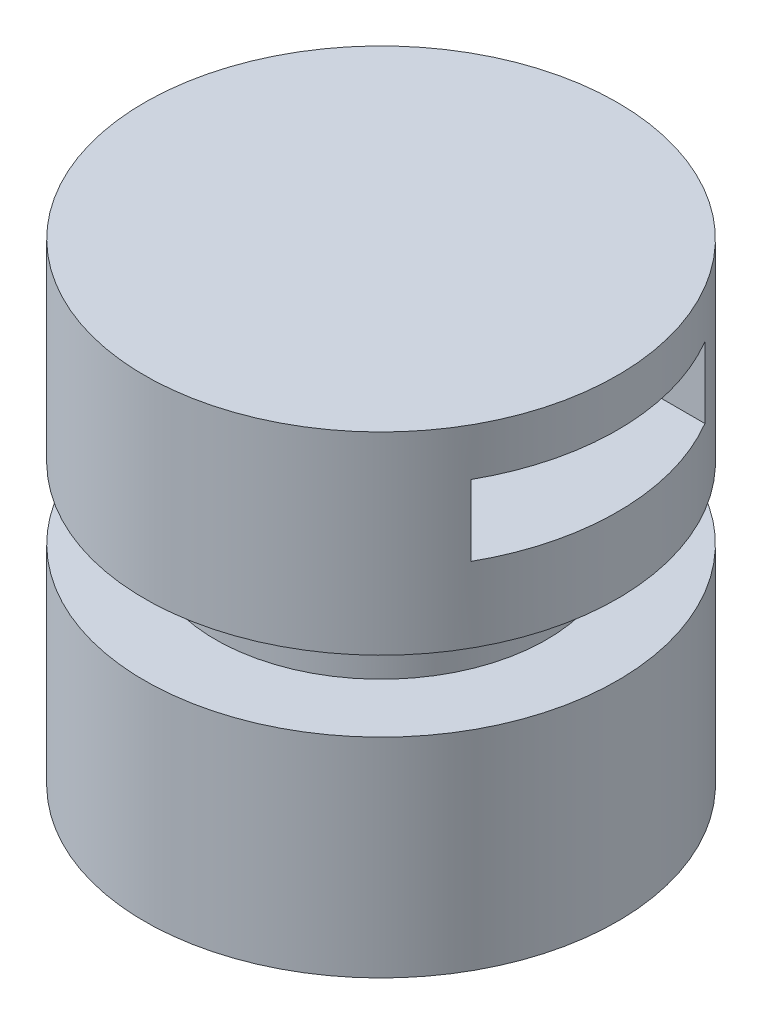
ISO-10303-21;
HEADER;
FILE_DESCRIPTION(('STEP AP214'),'2;1');
FILE_NAME('part.step','',(''),(''),'','','');
FILE_SCHEMA(('AUTOMOTIVE_DESIGN { 1 0 10303 214 1 1 1 1 }'));
ENDSEC;
DATA;
#1=APPLICATION_CONTEXT('core data for automotive mechanical design processes');
#2=APPLICATION_PROTOCOL_DEFINITION('international standard','automotive_design',2000,#1);
#3=PRODUCT_CONTEXT('',#1,'mechanical');
#4=PRODUCT('Part','Part','',(#3));
#5=PRODUCT_RELATED_PRODUCT_CATEGORY('part','',(#4));
#6=PRODUCT_DEFINITION_FORMATION('','',#4);
#7=PRODUCT_DEFINITION_CONTEXT('part definition',#1,'design');
#8=PRODUCT_DEFINITION('design','',#6,#7);
#9=PRODUCT_DEFINITION_SHAPE('','',#8);
#10=(LENGTH_UNIT() NAMED_UNIT(*) SI_UNIT(.MILLI.,.METRE.));
#11=(NAMED_UNIT(*) PLANE_ANGLE_UNIT() SI_UNIT($,.RADIAN.));
#12=(NAMED_UNIT(*) SI_UNIT($,.STERADIAN.) SOLID_ANGLE_UNIT());
#13=UNCERTAINTY_MEASURE_WITH_UNIT(LENGTH_MEASURE(1.E-05),#10,'distance_accuracy_value','');
#14=(GEOMETRIC_REPRESENTATION_CONTEXT(3) GLOBAL_UNCERTAINTY_ASSIGNED_CONTEXT((#13)) GLOBAL_UNIT_ASSIGNED_CONTEXT((#10,
#11,#12)) REPRESENTATION_CONTEXT('',''));
#15=CARTESIAN_POINT('',(0.,0.,0.));
#16=DIRECTION('',(0.,0.,1.));
#17=DIRECTION('',(1.,0.,0.));
#18=AXIS2_PLACEMENT_3D('',#15,#16,#17);
#19=CARTESIAN_POINT('',(0.,0.,0.));
#20=DIRECTION('',(0.,-1.,0.));
#21=DIRECTION('',(0.,0.,-1.));
#22=AXIS2_PLACEMENT_3D('',#19,#20,#21);
#23=CYLINDRICAL_SURFACE('',#22,100.);
#24=CARTESIAN_POINT('',(0.,150.,0.));
#25=DIRECTION('',(0.,1.,0.));
#26=DIRECTION('',(0.,0.,1.));
#27=AXIS2_PLACEMENT_3D('',#24,#25,#26);
#28=CIRCLE('',#27,100.);
#29=CARTESIAN_POINT('',(87.1076393875428,150.,49.1147550164897));
#30=VERTEX_POINT('',#29);
#31=CARTESIAN_POINT('',(86.0853753140923,150.,-50.8852449835104));
#32=VERTEX_POINT('',#31);
#33=EDGE_CURVE('E77',#30,#32,#28,.T.);
#34=ORIENTED_EDGE('',*,*,#33,.F.);
#35=DIRECTION('',(0.,-1.,0.));
#36=VECTOR('',#35,1.);
#37=CARTESIAN_POINT('',(87.1076393875428,0.,49.1147550164897));
#38=LINE('',#37,#36);
#39=CARTESIAN_POINT('',(87.1076393875428,180.,49.1147550164897));
#40=VERTEX_POINT('',#39);
#41=EDGE_CURVE('E79',#40,#30,#38,.T.);
#42=ORIENTED_EDGE('',*,*,#41,.F.);
#43=CARTESIAN_POINT('',(0.,180.,0.));
#44=DIRECTION('',(0.,1.,0.));
#45=DIRECTION('',(0.,0.,1.));
#46=AXIS2_PLACEMENT_3D('',#43,#44,#45);
#47=CIRCLE('',#46,100.);
#48=CARTESIAN_POINT('',(86.0853753140923,180.,-50.8852449835104));
#49=VERTEX_POINT('',#48);
#50=EDGE_CURVE('E56',#40,#49,#47,.T.);
#51=ORIENTED_EDGE('',*,*,#50,.T.);
#52=DIRECTION('',(0.,-1.,0.));
#53=VECTOR('',#52,1.);
#54=CARTESIAN_POINT('',(86.0853753140923,0.,-50.8852449835104));
#55=LINE('',#54,#53);
#56=EDGE_CURVE('E80',#49,#32,#55,.T.);
#57=ORIENTED_EDGE('',*,*,#56,.T.);
#58=EDGE_LOOP('',(#34,#42,#51,#57));
#59=FACE_BOUND('',#58,.T.);
#60=CARTESIAN_POINT('',(0.,200.,0.));
#61=DIRECTION('',(0.,-1.,0.));
#62=DIRECTION('',(0.,0.,-1.));
#63=AXIS2_PLACEMENT_3D('',#60,#61,#62);
#64=CIRCLE('',#63,100.);
#65=CARTESIAN_POINT('',(0.,200.,-100.));
#66=VERTEX_POINT('',#65);
#67=EDGE_CURVE('E84',#66,#66,#64,.T.);
#68=ORIENTED_EDGE('',*,*,#67,.T.);
#69=EDGE_LOOP('',(#68));
#70=FACE_BOUND('',#69,.T.);
#71=CARTESIAN_POINT('',(0.,118.22070212667,0.));
#72=DIRECTION('',(0.,-1.,0.));
#73=DIRECTION('',(0.,0.,-1.));
#74=AXIS2_PLACEMENT_3D('',#71,#72,#73);
#75=CIRCLE('',#74,100.);
#76=CARTESIAN_POINT('',(0.,118.22070212667,-100.));
#77=VERTEX_POINT('',#76);
#78=EDGE_CURVE('E102',#77,#77,#75,.T.);
#79=ORIENTED_EDGE('',*,*,#78,.F.);
#80=EDGE_LOOP('',(#79));
#81=FACE_BOUND('',#80,.T.);
#82=DIRECTION('',(0.,-1.,0.));
#83=VECTOR('',#82,1.);
#84=CARTESIAN_POINT('',(-86.0853753140923,0.,-50.8852449835104));
#85=LINE('',#84,#83);
#86=CARTESIAN_POINT('',(-86.0853753140923,150.,-50.8852449835104));
#87=VERTEX_POINT('',#86);
#88=CARTESIAN_POINT('',(-86.0853753140923,180.,-50.8852449835104));
#89=VERTEX_POINT('',#88);
#90=EDGE_CURVE('E11',#87,#89,#85,.F.);
#91=ORIENTED_EDGE('',*,*,#90,.T.);
#92=CARTESIAN_POINT('',(-87.1076393875428,180.,49.1147550164897));
#93=VERTEX_POINT('',#92);
#94=EDGE_CURVE('E117',#89,#93,#47,.T.);
#95=ORIENTED_EDGE('',*,*,#94,.T.);
#96=DIRECTION('',(0.,-1.,0.));
#97=VECTOR('',#96,1.);
#98=CARTESIAN_POINT('',(-87.1076393875428,0.,49.1147550164897));
#99=LINE('',#98,#97);
#100=CARTESIAN_POINT('',(-87.1076393875428,150.,49.1147550164897));
#101=VERTEX_POINT('',#100);
#102=EDGE_CURVE('E41',#101,#93,#99,.F.);
#103=ORIENTED_EDGE('',*,*,#102,.F.);
#104=EDGE_CURVE('E86',#87,#101,#28,.T.);
#105=ORIENTED_EDGE('',*,*,#104,.F.);
#106=EDGE_LOOP('',(#91,#95,#103,#105));
#107=FACE_BOUND('',#106,.T.);
#108=ADVANCED_FACE('F33',(#59,#70,#81,#107),#23,.T.);
#109=CARTESIAN_POINT('',(0.,0.,0.));
#110=DIRECTION('',(0.,-1.,0.));
#111=DIRECTION('',(0.,0.,-1.));
#112=AXIS2_PLACEMENT_3D('',#109,#110,#111);
#113=CIRCLE('',#112,100.);
#114=CARTESIAN_POINT('',(0.,0.,-100.));
#115=VERTEX_POINT('',#114);
#116=EDGE_CURVE('E111',#115,#115,#113,.T.);
#117=ORIENTED_EDGE('',*,*,#116,.F.);
#118=EDGE_LOOP('',(#117));
#119=FACE_BOUND('',#118,.T.);
#120=CARTESIAN_POINT('',(0.,88.2207021266703,0.));
#121=DIRECTION('',(0.,-1.,0.));
#122=DIRECTION('',(0.,0.,-1.));
#123=AXIS2_PLACEMENT_3D('',#120,#121,#122);
#124=CIRCLE('',#123,100.);
#125=CARTESIAN_POINT('',(0.,88.2207021266703,-100.));
#126=VERTEX_POINT('',#125);
#127=EDGE_CURVE('E105',#126,#126,#124,.T.);
#128=ORIENTED_EDGE('',*,*,#127,.T.);
#129=EDGE_LOOP('',(#128));
#130=FACE_BOUND('',#129,.T.);
#131=ADVANCED_FACE('F134',(#119,#130),#23,.T.);
#132=CARTESIAN_POINT('',(0.,0.,0.));
#133=DIRECTION('',(0.,1.,0.));
#134=DIRECTION('',(0.,0.,1.));
#135=AXIS2_PLACEMENT_3D('',#132,#133,#134);
#136=PLANE('',#135);
#137=ORIENTED_EDGE('',*,*,#116,.T.);
#138=EDGE_LOOP('',(#137));
#139=FACE_BOUND('',#138,.T.);
#140=ADVANCED_FACE('F138',(#139),#136,.F.);
#141=CARTESIAN_POINT('',(0.,0.,0.));
#142=DIRECTION('',(0.,-1.,0.));
#143=DIRECTION('',(0.,0.,-1.));
#144=AXIS2_PLACEMENT_3D('',#141,#142,#143);
#145=CYLINDRICAL_SURFACE('',#144,70.);
#146=CARTESIAN_POINT('',(0.,118.22070212667,0.));
#147=DIRECTION('',(0.,-1.,0.));
#148=DIRECTION('',(0.,0.,-1.));
#149=AXIS2_PLACEMENT_3D('',#146,#147,#148);
#150=CIRCLE('',#149,70.);
#151=CARTESIAN_POINT('',(0.,118.22070212667,-70.));
#152=VERTEX_POINT('',#151);
#153=EDGE_CURVE('E99',#152,#152,#150,.T.);
#154=ORIENTED_EDGE('',*,*,#153,.T.);
#155=EDGE_LOOP('',(#154));
#156=FACE_BOUND('',#155,.T.);
#157=CARTESIAN_POINT('',(0.,88.2207021266703,0.));
#158=DIRECTION('',(0.,-1.,0.));
#159=DIRECTION('',(0.,0.,-1.));
#160=AXIS2_PLACEMENT_3D('',#157,#158,#159);
#161=CIRCLE('',#160,70.);
#162=CARTESIAN_POINT('',(0.,88.2207021266703,-70.));
#163=VERTEX_POINT('',#162);
#164=EDGE_CURVE('E108',#163,#163,#161,.T.);
#165=ORIENTED_EDGE('',*,*,#164,.F.);
#166=EDGE_LOOP('',(#165));
#167=FACE_BOUND('',#166,.T.);
#168=ADVANCED_FACE('F143',(#156,#167),#145,.T.);
#169=CARTESIAN_POINT('',(0.,88.2207021266703,70.));
#170=DIRECTION('',(0.,1.,0.));
#171=DIRECTION('',(0.,0.,1.));
#172=AXIS2_PLACEMENT_3D('',#169,#170,#171);
#173=PLANE('',#172);
#174=ORIENTED_EDGE('',*,*,#164,.T.);
#175=EDGE_LOOP('',(#174));
#176=FACE_BOUND('',#175,.T.);
#177=ORIENTED_EDGE('',*,*,#127,.F.);
#178=EDGE_LOOP('',(#177));
#179=FACE_BOUND('',#178,.T.);
#180=ADVANCED_FACE('F147',(#176,#179),#173,.T.);
#181=CARTESIAN_POINT('',(0.,118.22070212667,70.));
#182=DIRECTION('',(0.,-1.,0.));
#183=DIRECTION('',(0.,0.,-1.));
#184=AXIS2_PLACEMENT_3D('',#181,#182,#183);
#185=PLANE('',#184);
#186=ORIENTED_EDGE('',*,*,#78,.T.);
#187=EDGE_LOOP('',(#186));
#188=FACE_BOUND('',#187,.T.);
#189=ORIENTED_EDGE('',*,*,#153,.F.);
#190=EDGE_LOOP('',(#189));
#191=FACE_BOUND('',#190,.T.);
#192=ADVANCED_FACE('F151',(#188,#191),#185,.T.);
#193=CARTESIAN_POINT('',(0.,200.,0.));
#194=DIRECTION('',(0.,-1.,0.));
#195=DIRECTION('',(0.,0.,-1.));
#196=AXIS2_PLACEMENT_3D('',#193,#194,#195);
#197=PLANE('',#196);
#198=ORIENTED_EDGE('',*,*,#67,.F.);
#199=EDGE_LOOP('',(#198));
#200=FACE_BOUND('',#199,.T.);
#201=ADVANCED_FACE('F35',(#200),#197,.F.);
#202=CARTESIAN_POINT('',(-100.,180.,-50.8852449835104));
#203=DIRECTION('',(0.,1.,0.));
#204=DIRECTION('',(0.,0.,1.));
#205=AXIS2_PLACEMENT_3D('',#202,#203,#204);
#206=PLANE('',#205);
#207=DIRECTION('',(1.,0.,0.));
#208=VECTOR('',#207,1.);
#209=CARTESIAN_POINT('',(-100.,180.,49.1147550164897));
#210=LINE('',#209,#208);
#211=EDGE_CURVE('E88',#93,#40,#210,.T.);
#212=ORIENTED_EDGE('',*,*,#211,.F.);
#213=ORIENTED_EDGE('',*,*,#94,.F.);
#214=DIRECTION('',(1.,0.,0.));
#215=VECTOR('',#214,1.);
#216=CARTESIAN_POINT('',(-100.,180.,-50.8852449835104));
#217=LINE('',#216,#215);
#218=EDGE_CURVE('E94',#89,#49,#217,.T.);
#219=ORIENTED_EDGE('',*,*,#218,.T.);
#220=ORIENTED_EDGE('',*,*,#50,.F.);
#221=EDGE_LOOP('',(#212,#213,#219,#220));
#222=FACE_BOUND('',#221,.T.);
#223=ADVANCED_FACE('F122',(#222),#206,.F.);
#224=CARTESIAN_POINT('',(-100.,150.,-50.8852449835104));
#225=DIRECTION('',(0.,0.,-1.));
#226=DIRECTION('',(0.,1.,0.));
#227=AXIS2_PLACEMENT_3D('',#224,#225,#226);
#228=PLANE('',#227);
#229=ORIENTED_EDGE('',*,*,#218,.F.);
#230=ORIENTED_EDGE('',*,*,#90,.F.);
#231=DIRECTION('',(1.,0.,0.));
#232=VECTOR('',#231,1.);
#233=CARTESIAN_POINT('',(-100.,150.,-50.8852449835104));
#234=LINE('',#233,#232);
#235=EDGE_CURVE('E92',#87,#32,#234,.T.);
#236=ORIENTED_EDGE('',*,*,#235,.T.);
#237=ORIENTED_EDGE('',*,*,#56,.F.);
#238=EDGE_LOOP('',(#229,#230,#236,#237));
#239=FACE_BOUND('',#238,.T.);
#240=ADVANCED_FACE('F124',(#239),#228,.F.);
#241=CARTESIAN_POINT('',(-100.,150.,-50.8852449835104));
#242=DIRECTION('',(0.,1.,0.));
#243=DIRECTION('',(0.,0.,1.));
#244=AXIS2_PLACEMENT_3D('',#241,#242,#243);
#245=PLANE('',#244);
#246=DIRECTION('',(1.,0.,0.));
#247=VECTOR('',#246,1.);
#248=CARTESIAN_POINT('',(-100.,150.,49.1147550164897));
#249=LINE('',#248,#247);
#250=EDGE_CURVE('E48',#101,#30,#249,.T.);
#251=ORIENTED_EDGE('',*,*,#250,.T.);
#252=ORIENTED_EDGE('',*,*,#33,.T.);
#253=ORIENTED_EDGE('',*,*,#235,.F.);
#254=ORIENTED_EDGE('',*,*,#104,.T.);
#255=EDGE_LOOP('',(#251,#252,#253,#254));
#256=FACE_BOUND('',#255,.T.);
#257=ADVANCED_FACE('F90',(#256),#245,.T.);
#258=CARTESIAN_POINT('',(-100.,150.,49.1147550164897));
#259=DIRECTION('',(0.,0.,-1.));
#260=DIRECTION('',(-1.,0.,0.));
#261=AXIS2_PLACEMENT_3D('',#258,#259,#260);
#262=PLANE('',#261);
#263=ORIENTED_EDGE('',*,*,#41,.T.);
#264=ORIENTED_EDGE('',*,*,#250,.F.);
#265=ORIENTED_EDGE('',*,*,#102,.T.);
#266=ORIENTED_EDGE('',*,*,#211,.T.);
#267=EDGE_LOOP('',(#263,#264,#265,#266));
#268=FACE_BOUND('',#267,.T.);
#269=ADVANCED_FACE('F87',(#268),#262,.T.);
#270=CLOSED_SHELL('',(#108,#131,#140,#168,#180,#192,#201,#223,#240,#257,#269));
#271=MANIFOLD_SOLID_BREP('B2',#270);
#272=ADVANCED_BREP_SHAPE_REPRESENTATION('',(#18,#271),#14);
#273=SHAPE_DEFINITION_REPRESENTATION(#9,#272);
ENDSEC;
END-ISO-10303-21;
